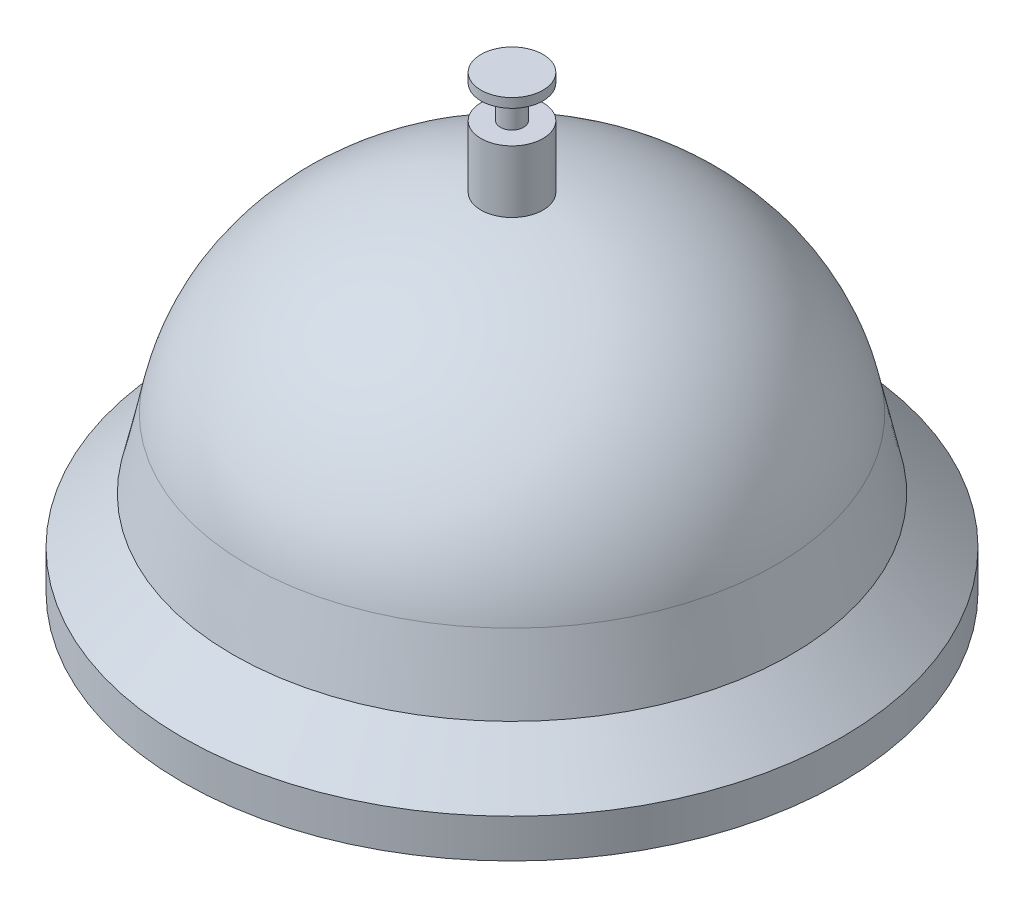
ISO-10303-21;
HEADER;
FILE_DESCRIPTION(('STEP AP214'),'2;1');
FILE_NAME('part.step','',(''),(''),'','','');
FILE_SCHEMA(('AUTOMOTIVE_DESIGN { 1 0 10303 214 1 1 1 1 }'));
ENDSEC;
DATA;
#1=APPLICATION_CONTEXT('core data for automotive mechanical design processes');
#2=APPLICATION_PROTOCOL_DEFINITION('international standard','automotive_design',2000,#1);
#3=PRODUCT_CONTEXT('',#1,'mechanical');
#4=PRODUCT('Part','Part','',(#3));
#5=PRODUCT_RELATED_PRODUCT_CATEGORY('part','',(#4));
#6=PRODUCT_DEFINITION_FORMATION('','',#4);
#7=PRODUCT_DEFINITION_CONTEXT('part definition',#1,'design');
#8=PRODUCT_DEFINITION('design','',#6,#7);
#9=PRODUCT_DEFINITION_SHAPE('','',#8);
#10=(LENGTH_UNIT() NAMED_UNIT(*) SI_UNIT(.MILLI.,.METRE.));
#11=(NAMED_UNIT(*) PLANE_ANGLE_UNIT() SI_UNIT($,.RADIAN.));
#12=(NAMED_UNIT(*) SI_UNIT($,.STERADIAN.) SOLID_ANGLE_UNIT());
#13=UNCERTAINTY_MEASURE_WITH_UNIT(LENGTH_MEASURE(1.E-05),#10,'distance_accuracy_value','');
#14=(GEOMETRIC_REPRESENTATION_CONTEXT(3) GLOBAL_UNCERTAINTY_ASSIGNED_CONTEXT((#13)) GLOBAL_UNIT_ASSIGNED_CONTEXT((#10,
#11,#12)) REPRESENTATION_CONTEXT('',''));
#15=CARTESIAN_POINT('',(0.,0.,0.));
#16=DIRECTION('',(0.,0.,1.));
#17=DIRECTION('',(1.,0.,0.));
#18=AXIS2_PLACEMENT_3D('',#15,#16,#17);
#19=CARTESIAN_POINT('',(0.,20.,-34.));
#20=CARTESIAN_POINT('',(0.,33.2048956625817,-31.3335737867942));
#21=CARTESIAN_POINT('',(0.,44.0758656872333,-19.2643134765452));
#22=CARTESIAN_POINT('',(0.,45.,0.));
#23=B_SPLINE_CURVE_WITH_KNOTS('',3,(#19,#20,#21,#22),.UNSPECIFIED.,.F.,.F.,(4,4),(0.,1.),.UNSPECIFIED.);
#24=CARTESIAN_POINT('',(0.,45.,0.));
#25=DIRECTION('',(0.,1.,0.));
#26=AXIS1_PLACEMENT('',#24,#25);
#27=SURFACE_OF_REVOLUTION('',#23,#26);
#28=CARTESIAN_POINT('',(0.,20.,0.));
#29=DIRECTION('',(0.,1.,0.));
#30=DIRECTION('',(0.,0.,1.));
#31=AXIS2_PLACEMENT_3D('',#28,#29,#30);
#32=CIRCLE('',#31,34.);
#33=CARTESIAN_POINT('',(0.,20.,34.));
#34=VERTEX_POINT('',#33);
#35=EDGE_CURVE('E115',#34,#34,#32,.T.);
#36=ORIENTED_EDGE('',*,*,#35,.T.);
#37=EDGE_LOOP('',(#36));
#38=FACE_BOUND('',#37,.T.);
#39=CARTESIAN_POINT('',(0.,44.6546632895546,0.));
#40=DIRECTION('',(0.,1.,0.));
#41=DIRECTION('',(0.,0.,1.));
#42=AXIS2_PLACEMENT_3D('',#39,#40,#41);
#43=CIRCLE('',#42,4.00000000000004);
#44=CARTESIAN_POINT('',(0.,44.6546632895546,4.00000000000004));
#45=VERTEX_POINT('',#44);
#46=EDGE_CURVE('E44',#45,#45,#43,.T.);
#47=ORIENTED_EDGE('',*,*,#46,.F.);
#48=EDGE_LOOP('',(#47));
#49=FACE_BOUND('',#48,.T.);
#50=ADVANCED_FACE('F40',(#38,#49),#27,.T.);
#51=CARTESIAN_POINT('',(0.,11.,0.));
#52=DIRECTION('',(0.,-1.,0.));
#53=DIRECTION('',(0.,0.,-1.));
#54=AXIS2_PLACEMENT_3D('',#51,#52,#53);
#55=CONICAL_SURFACE('',#54,36.,0.218668945873941);
#56=ORIENTED_EDGE('',*,*,#35,.F.);
#57=EDGE_LOOP('',(#56));
#58=FACE_BOUND('',#57,.T.);
#59=CARTESIAN_POINT('',(0.,11.,0.));
#60=DIRECTION('',(0.,1.,0.));
#61=DIRECTION('',(0.,0.,1.));
#62=AXIS2_PLACEMENT_3D('',#59,#60,#61);
#63=CIRCLE('',#62,36.);
#64=CARTESIAN_POINT('',(0.,11.,36.));
#65=VERTEX_POINT('',#64);
#66=EDGE_CURVE('E112',#65,#65,#63,.T.);
#67=ORIENTED_EDGE('',*,*,#66,.T.);
#68=EDGE_LOOP('',(#67));
#69=FACE_BOUND('',#68,.T.);
#70=ADVANCED_FACE('F124',(#58,#69),#55,.T.);
#71=CARTESIAN_POINT('',(0.,5.,0.));
#72=DIRECTION('',(0.,-1.,0.));
#73=DIRECTION('',(0.,0.,-1.));
#74=AXIS2_PLACEMENT_3D('',#71,#72,#73);
#75=CONICAL_SURFACE('',#74,42.5,0.825376850520739);
#76=ORIENTED_EDGE('',*,*,#66,.F.);
#77=EDGE_LOOP('',(#76));
#78=FACE_BOUND('',#77,.T.);
#79=CARTESIAN_POINT('',(0.,5.,0.));
#80=DIRECTION('',(0.,1.,0.));
#81=DIRECTION('',(0.,0.,1.));
#82=AXIS2_PLACEMENT_3D('',#79,#80,#81);
#83=CIRCLE('',#82,42.5);
#84=CARTESIAN_POINT('',(0.,5.,42.5));
#85=VERTEX_POINT('',#84);
#86=EDGE_CURVE('E108',#85,#85,#83,.T.);
#87=ORIENTED_EDGE('',*,*,#86,.T.);
#88=EDGE_LOOP('',(#87));
#89=FACE_BOUND('',#88,.T.);
#90=ADVANCED_FACE('F128',(#78,#89),#75,.T.);
#91=CARTESIAN_POINT('',(0.,45.,0.));
#92=DIRECTION('',(0.,1.,0.));
#93=DIRECTION('',(0.,0.,1.));
#94=AXIS2_PLACEMENT_3D('',#91,#92,#93);
#95=CYLINDRICAL_SURFACE('',#94,42.5);
#96=ORIENTED_EDGE('',*,*,#86,.F.);
#97=EDGE_LOOP('',(#96));
#98=FACE_BOUND('',#97,.T.);
#99=CARTESIAN_POINT('',(0.,0.,0.));
#100=DIRECTION('',(0.,1.,0.));
#101=DIRECTION('',(0.,0.,1.));
#102=AXIS2_PLACEMENT_3D('',#99,#100,#101);
#103=CIRCLE('',#102,42.5);
#104=CARTESIAN_POINT('',(0.,0.,42.5));
#105=VERTEX_POINT('',#104);
#106=EDGE_CURVE('E63',#105,#105,#103,.T.);
#107=ORIENTED_EDGE('',*,*,#106,.T.);
#108=EDGE_LOOP('',(#107));
#109=FACE_BOUND('',#108,.T.);
#110=ADVANCED_FACE('F133',(#98,#109),#95,.T.);
#111=CARTESIAN_POINT('',(0.,0.,0.));
#112=DIRECTION('',(0.,1.,0.));
#113=DIRECTION('',(0.,0.,1.));
#114=AXIS2_PLACEMENT_3D('',#111,#112,#113);
#115=PLANE('',#114);
#116=CARTESIAN_POINT('',(0.,0.,0.));
#117=DIRECTION('',(0.,1.,0.));
#118=DIRECTION('',(0.,0.,1.));
#119=AXIS2_PLACEMENT_3D('',#116,#117,#118);
#120=CIRCLE('',#119,41.5);
#121=CARTESIAN_POINT('',(0.,0.,41.5));
#122=VERTEX_POINT('',#121);
#123=EDGE_CURVE('E159',#122,#122,#120,.T.);
#124=ORIENTED_EDGE('',*,*,#123,.T.);
#125=EDGE_LOOP('',(#124));
#126=FACE_BOUND('',#125,.T.);
#127=ORIENTED_EDGE('',*,*,#106,.F.);
#128=EDGE_LOOP('',(#127));
#129=FACE_BOUND('',#128,.T.);
#130=ADVANCED_FACE('F55',(#126,#129),#115,.F.);
#131=CARTESIAN_POINT('',(0.,19.6041878504334,-34.0799251972964));
#132=CARTESIAN_POINT('',(0.,19.7361252336222,-34.0532834648643));
#133=CARTESIAN_POINT('',(0.,19.8680626168111,-34.0266417324321));
#134=CARTESIAN_POINT('',(0.,33.1937383188883,-31.3358267567876));
#135=CARTESIAN_POINT('',(0.,44.0574933875595,-19.2847023637044));
#136=CARTESIAN_POINT('',(0.,44.9976361867924,-0.0488161518919489));
#137=B_SPLINE_CURVE_WITH_KNOTS('',3,(#131,#132,#133,#134,#135,#136),.UNSPECIFIED.,.F.,.F.,(4,2,
4),(-0.009991550600642,0.,0.9991550600642),.UNSPECIFIED.);
#138=CARTESIAN_POINT('',(0.,45.,0.));
#139=DIRECTION('',(0.,1.,0.));
#140=AXIS1_PLACEMENT('',#138,#139);
#141=SURFACE_OF_REVOLUTION('',#137,#140);
#142=OFFSET_SURFACE('',#141,-1.,.F.);
#143=CARTESIAN_POINT('',(0.,43.9988284058283,0.));
#144=VERTEX_POINT('',#143);
#145=VERTEX_LOOP('',#144);
#146=FACE_BOUND('',#145,.T.);
#147=CARTESIAN_POINT('',(0.,19.7925491529406,33.021706359646));
#148=CARTESIAN_POINT('',(-0.540316952465533,19.7925491529218,33.0217178211135));
#149=CARTESIAN_POINT('',(-1.08063292967317,19.792549152908,33.0084454078794));
#150=CARTESIAN_POINT('',(-2.15996373717558,19.7925491529003,32.9554151284438));
#151=CARTESIAN_POINT('',(-2.69897856747046,19.7925491529064,32.9156572622443));
#152=CARTESIAN_POINT('',(-3.7744078848469,19.7925491529481,32.8097383733121));
#153=CARTESIAN_POINT('',(-4.31082237192842,19.7925491529837,32.743577350579));
#154=CARTESIAN_POINT('',(-5.37975891094638,19.7925491529877,32.5850151492471));
#155=CARTESIAN_POINT('',(-5.91228096288236,19.7925491529561,32.4926139706453));
#156=CARTESIAN_POINT('',(-6.9721496916611,19.7925491529615,32.2817930920059));
#157=CARTESIAN_POINT('',(-7.49949636850437,19.7925491529985,32.1633733919709));
#158=CARTESIAN_POINT('',(-8.5477439355757,19.792549152993,31.9008010133152));
#159=CARTESIAN_POINT('',(-9.06864482580364,19.7925491529506,31.756648334694));
#160=CARTESIAN_POINT('',(-10.102745920335,19.7925491529353,31.442957205764));
#161=CARTESIAN_POINT('',(-10.6159461246385,19.7925491529624,31.2734187554555));
#162=CARTESIAN_POINT('',(-11.6334095039974,19.792549152966,30.9093645347766));
#163=CARTESIAN_POINT('',(-12.137672679053,19.7925491529425,30.7148487644068));
#164=CARTESIAN_POINT('',(-13.1360471855322,19.7925491529318,30.3013085041184));
#165=CARTESIAN_POINT('',(-13.6301585169557,19.7925491529446,30.0822840141992));
#166=CARTESIAN_POINT('',(-14.6070389787491,19.7925491529517,29.6202539653448));
#167=CARTESIAN_POINT('',(-15.0898081091191,19.7925491529461,29.3772484064096));
#168=CARTESIAN_POINT('',(-16.042841135652,19.7925491529438,28.8678416408431));
#169=CARTESIAN_POINT('',(-16.5131050318153,19.7925491529471,28.6014404342124));
#170=CARTESIAN_POINT('',(-17.4399946830545,19.7925491529444,28.0458841571801));
#171=CARTESIAN_POINT('',(-17.8966204381299,19.7925491529383,27.7567290867778));
#172=CARTESIAN_POINT('',(-18.7951337557283,19.7925491529343,27.1563616820768));
#173=CARTESIAN_POINT('',(-19.2370213182513,19.7925491529364,26.8451493477786));
#174=CARTESIAN_POINT('',(-20.1049937049084,19.7925491529319,26.2014171530663));
#175=CARTESIAN_POINT('',(-20.5310785290424,19.7925491529251,25.8688972926525));
#176=CARTESIAN_POINT('',(-21.3664189632672,19.7925491529352,25.1833511151621));
#177=CARTESIAN_POINT('',(-21.7756745733575,19.7925491529519,24.8303247980852));
#178=CARTESIAN_POINT('',(-22.5763706468891,19.7925491529543,24.104616178596));
#179=CARTESIAN_POINT('',(-22.96781111033,19.79254915294,23.7319338761835));
#180=CARTESIAN_POINT('',(-23.7319338761835,19.7925491529401,22.96781111033));
#181=CARTESIAN_POINT('',(-24.1046161785961,19.7925491529544,22.5763706468891));
#182=CARTESIAN_POINT('',(-24.8303247980781,19.7925491529519,21.7756745733653));
#183=CARTESIAN_POINT('',(-25.1833511151482,19.7925491529351,21.3664189632832));
#184=CARTESIAN_POINT('',(-25.8688972926226,19.7925491529252,20.5310785290798));
#185=CARTESIAN_POINT('',(-26.2014171530274,19.7925491529322,20.1049937049591));
#186=CARTESIAN_POINT('',(-26.8451493477474,19.7925491529361,19.2370213182952));
#187=CARTESIAN_POINT('',(-27.1563616820606,19.792549152933,18.7951337557506));
#188=CARTESIAN_POINT('',(-27.7567290867823,19.7925491529396,17.8966204381251));
#189=CARTESIAN_POINT('',(-28.0458841571913,19.7925491529491,17.4399946830446));
#190=CARTESIAN_POINT('',(-28.6014404342166,19.7925491529424,16.5131050317996));
#191=CARTESIAN_POINT('',(-28.8678416408338,19.792549152926,16.0428411356356));
#192=CARTESIAN_POINT('',(-29.3772484064468,19.792549152925,15.0898081090997));
#193=CARTESIAN_POINT('',(-29.6202539654418,19.7925491529403,14.6070389787274));
#194=CARTESIAN_POINT('',(-30.0822840141377,19.7925491529384,13.6301585169109));
#195=CARTESIAN_POINT('',(-30.3013085038384,19.7925491529211,13.1360471854666));
#196=CARTESIAN_POINT('',(-30.714848764726,19.7925491529375,12.1376726790323));
#197=CARTESIAN_POINT('',(-30.9093645359154,19.7925491529711,11.6334095040433));
#198=CARTESIAN_POINT('',(-31.2734187543191,19.7925491529712,10.6159461245777));
#199=CARTESIAN_POINT('',(-31.4429572015306,19.7925491529377,10.1027459201001));
#200=CARTESIAN_POINT('',(-31.7566483389501,19.7925491529482,9.06864482596402));
#201=CARTESIAN_POINT('',(-31.9008010291589,19.7925491529923,8.54774393630578));
#202=CARTESIAN_POINT('',(-32.1633733761504,19.7925491529991,7.49949636768157));
#203=CARTESIAN_POINT('',(-32.2817930329338,19.7925491529618,6.97214968871573));
#204=CARTESIAN_POINT('',(-32.4926140297268,19.7925491529559,5.91228096578034));
#205=CARTESIAN_POINT('',(-32.5850153697357,19.7925491529873,5.37975892181062));
#206=CARTESIAN_POINT('',(-32.7435771300798,19.7925491529841,4.31082236113562));
#207=CARTESIAN_POINT('',(-32.8097375504151,19.7925491529496,3.77440784443032));
#208=CARTESIAN_POINT('',(-32.915658085142,19.7925491529049,2.69897860787977));
#209=CARTESIAN_POINT('',(-32.9554181995357,19.7925491528948,2.15996388803471));
#210=CARTESIAN_POINT('',(-33.0084423367886,19.7925491529135,1.0806327787932));
#211=CARTESIAN_POINT('',(-33.0217063596457,19.7925491529423,0.540316389396641));
#212=CARTESIAN_POINT('',(-33.0217063596463,19.792549152939,-0.540316389396594));
#213=CARTESIAN_POINT('',(-33.0084423367899,19.7925491529068,-1.08063277879327));
#214=CARTESIAN_POINT('',(-32.9554181995343,19.7925491529015,-2.15996388803445));
#215=CARTESIAN_POINT('',(-32.9156580851373,19.7925491529284,-2.69897860787907));
#216=CARTESIAN_POINT('',(-32.8097375504198,19.7925491529261,-3.77440784443112));
#217=CARTESIAN_POINT('',(-32.7435771300973,19.7925491528968,-4.31082236113834));
#218=CARTESIAN_POINT('',(-32.5850153697507,19.7925491529114,-5.37975892181356));
#219=CARTESIAN_POINT('',(-32.4926140297268,19.7925491529552,-5.91228096578156));
#220=CARTESIAN_POINT('',(-32.2817930329332,19.7925491529624,-6.97214968871773));
#221=CARTESIAN_POINT('',(-32.1633733761646,19.7925491529259,-7.4994963676861));
#222=CARTESIAN_POINT('',(-31.9008010291681,19.7925491529055,-8.54774393634087));
#223=CARTESIAN_POINT('',(-31.7566483389382,19.7925491529217,-9.06864482602676));
#224=CARTESIAN_POINT('',(-31.4429572015168,19.7925491529521,-10.10274592013));
#225=CARTESIAN_POINT('',(-31.2734187543289,19.7925491529664,-10.6159461245486));
#226=CARTESIAN_POINT('',(-30.9093645359408,19.7925491529621,-11.6334095039822));
#227=CARTESIAN_POINT('',(-30.7148487647392,19.7925491529437,-12.1376726789968));
#228=CARTESIAN_POINT('',(-30.3013085038399,19.7925491529307,-13.1360471854584));
#229=CARTESIAN_POINT('',(-30.082284014141,19.7925491529361,-13.6301585169048));
#230=CARTESIAN_POINT('',(-29.620253965444,19.7925491529426,-14.6070389787218));
#231=CARTESIAN_POINT('',(-29.3772484064462,19.7925491529436,-15.0898081090926));
#232=CARTESIAN_POINT('',(-28.8678416408322,19.7925491529462,-16.0428411356302));
#233=CARTESIAN_POINT('',(-28.6014404342166,19.7925491529478,-16.5131050317974));
#234=CARTESIAN_POINT('',(-28.0458841571946,19.7925491529437,-17.4399946830412));
#235=CARTESIAN_POINT('',(-27.7567290867875,19.7925491529381,-17.8966204381174));
#236=CARTESIAN_POINT('',(-27.1563616820897,19.7925491529345,-18.7951337557069));
#237=CARTESIAN_POINT('',(-26.8451493477998,19.7925491529365,-19.2370213182207));
#238=CARTESIAN_POINT('',(-26.2014171530842,19.7925491529318,-20.1049937048862));
#239=CARTESIAN_POINT('',(-25.8688972926573,19.7925491529252,-20.531078529037));
#240=CARTESIAN_POINT('',(-25.1833511151552,19.7925491529351,-21.3664189632751));
#241=CARTESIAN_POINT('',(-24.8303247980806,19.7925491529518,-21.7756745733627));
#242=CARTESIAN_POINT('',(-24.1046161786024,19.7925491529545,-22.576370646882));
#243=CARTESIAN_POINT('',(-23.7319338761988,19.7925491529405,-22.9678111103136));
#244=CARTESIAN_POINT('',(-22.96781111034,19.7925491529396,-23.7319338761744));
#245=CARTESIAN_POINT('',(-22.5763706468835,19.7925491529526,-24.1046161786023));
#246=CARTESIAN_POINT('',(-21.7756745733455,19.7925491529537,-24.8303247980949));
#247=CARTESIAN_POINT('',(-21.3664189632656,19.7925491529418,-25.1833511151613));
#248=CARTESIAN_POINT('',(-20.5310785290482,19.7925491529185,-25.8688972926499));
#249=CARTESIAN_POINT('',(-20.1049937049103,19.7925491529072,-26.2014171530717));
#250=CARTESIAN_POINT('',(-19.2370213182456,19.7925491529119,-26.8451493477884));
#251=CARTESIAN_POINT('',(-18.7951337557188,19.7925491529279,-27.1563616820833));
#252=CARTESIAN_POINT('',(-17.8966204381142,19.7925491529447,-27.756729086788));
#253=CARTESIAN_POINT('',(-17.4399946830361,19.7925491529455,-28.0458841571974));
#254=CARTESIAN_POINT('',(-16.5131050317993,19.792549152946,-28.6014404342157));
#255=CARTESIAN_POINT('',(-16.0428411356414,19.7925491529457,-28.8678416408259));
#256=CARTESIAN_POINT('',(-15.0898081091059,19.7925491529442,-29.3772484064395));
#257=CARTESIAN_POINT('',(-14.6070389787275,19.792549152943,-29.6202539654413));
#258=CARTESIAN_POINT('',(-13.6301585169091,19.7925491529357,-30.082284014139));
#259=CARTESIAN_POINT('',(-13.1360471854693,19.7925491529295,-30.3013085038352));
#260=CARTESIAN_POINT('',(-12.1376726790138,19.7925491529448,-30.7148487647322));
#261=CARTESIAN_POINT('',(-11.6334095039985,19.7925491529663,-30.9093645359338));
#262=CARTESIAN_POINT('',(-10.6159461245317,19.7925491529622,-31.2734187543362));
#263=CARTESIAN_POINT('',(-10.1027459200802,19.7925491529367,-31.4429572015367));
#264=CARTESIAN_POINT('',(-9.06864482597438,19.7925491529492,-31.7566483389468));
#265=CARTESIAN_POINT('',(-8.54774393631999,19.7925491529872,-31.9008010291561));
#266=CARTESIAN_POINT('',(-7.49949636769881,19.7925491530043,-32.1633733761454));
#267=CARTESIAN_POINT('',(-6.97214968873211,19.7925491529835,-32.2817930329258));
#268=CARTESIAN_POINT('',(-5.91228096579634,19.7925491529342,-32.4926140297284));
#269=CARTESIAN_POINT('',(-5.37975892182708,19.7925491529058,-32.5850153697496));
#270=CARTESIAN_POINT('',(-4.31082236114881,19.7925491529025,-32.7435771300948));
#271=CARTESIAN_POINT('',(-3.77440784443978,19.7925491529277,-32.8097375504185));
#272=CARTESIAN_POINT('',(-2.69897860788494,19.7925491529268,-32.9156580851371));
#273=CARTESIAN_POINT('',(-2.15996388803935,19.7925491529007,-32.9554181995342));
#274=CARTESIAN_POINT('',(-1.08063277879591,19.7925491529076,-33.0084423367897));
#275=CARTESIAN_POINT('',(-0.540316389397953,19.7925491529406,-33.021706359646));
#276=CARTESIAN_POINT('',(0.540316389397953,19.7925491529406,-33.021706359646));
#277=CARTESIAN_POINT('',(1.08063277879591,19.7925491529076,-33.0084423367897));
#278=CARTESIAN_POINT('',(2.15996388803935,19.7925491529007,-32.9554181995342));
#279=CARTESIAN_POINT('',(2.69897860788494,19.7925491529268,-32.9156580851371));
#280=CARTESIAN_POINT('',(3.77440784443978,19.7925491529277,-32.8097375504185));
#281=CARTESIAN_POINT('',(4.31082236114881,19.7925491529025,-32.7435771300948));
#282=CARTESIAN_POINT('',(5.37975892182708,19.7925491529058,-32.5850153697496));
#283=CARTESIAN_POINT('',(5.91228096579634,19.7925491529342,-32.4926140297284));
#284=CARTESIAN_POINT('',(6.97214968873211,19.7925491529835,-32.2817930329258));
#285=CARTESIAN_POINT('',(7.49949636769881,19.7925491530043,-32.1633733761454));
#286=CARTESIAN_POINT('',(8.54774393631999,19.7925491529872,-31.9008010291561));
#287=CARTESIAN_POINT('',(9.06864482597438,19.7925491529492,-31.7566483389468));
#288=CARTESIAN_POINT('',(10.1027459200802,19.7925491529367,-31.4429572015367));
#289=CARTESIAN_POINT('',(10.6159461245317,19.7925491529622,-31.2734187543362));
#290=CARTESIAN_POINT('',(11.6334095039985,19.7925491529663,-30.9093645359338));
#291=CARTESIAN_POINT('',(12.1376726790138,19.7925491529448,-30.7148487647322));
#292=CARTESIAN_POINT('',(13.1360471854693,19.7925491529296,-30.3013085038352));
#293=CARTESIAN_POINT('',(13.6301585169091,19.7925491529358,-30.082284014139));
#294=CARTESIAN_POINT('',(14.6070389787275,19.7925491529429,-29.6202539654413));
#295=CARTESIAN_POINT('',(15.0898081091059,19.7925491529437,-29.3772484064395));
#296=CARTESIAN_POINT('',(16.0428411356413,19.7925491529462,-28.8678416408258));
#297=CARTESIAN_POINT('',(16.5131050317991,19.7925491529478,-28.6014404342154));
#298=CARTESIAN_POINT('',(17.4399946830443,19.7925491529437,-28.0458841571929));
#299=CARTESIAN_POINT('',(17.8966204381307,19.7925491529381,-27.7567290867792));
#300=CARTESIAN_POINT('',(18.7951337557608,19.7925491529345,-27.1563616820531));
#301=CARTESIAN_POINT('',(19.2370213183045,19.7925491529365,-26.8451493477406));
#302=CARTESIAN_POINT('',(20.1049937049598,19.7925491529318,-26.2014171530268));
#303=CARTESIAN_POINT('',(20.5310785290731,19.7925491529251,-25.8688972926277));
#304=CARTESIAN_POINT('',(21.3664189632664,19.7925491529352,-25.1833511151623));
#305=CARTESIAN_POINT('',(21.7756745733457,19.7925491529519,-24.8303247980952));
#306=CARTESIAN_POINT('',(22.5763706468745,19.7925491529543,-24.1046161786099));
#307=CARTESIAN_POINT('',(22.9678111103229,19.79254915294,-23.7319338761906));
#308=CARTESIAN_POINT('',(23.7319338761826,19.79254915294,-22.9678111103308));
#309=CARTESIAN_POINT('',(24.1046161785945,19.7925491529543,-22.5763706468908));
#310=CARTESIAN_POINT('',(24.8303247980806,19.7925491529519,-21.7756745733627));
#311=CARTESIAN_POINT('',(25.1833511151552,19.7925491529352,-21.3664189632751));
#312=CARTESIAN_POINT('',(25.868897292634,19.7925491529251,-20.5310785290654));
#313=CARTESIAN_POINT('',(26.201417153039,19.7925491529318,-20.1049937049441));
#314=CARTESIAN_POINT('',(26.845149347752,19.7925491529365,-19.2370213182882));
#315=CARTESIAN_POINT('',(27.1563616820587,19.7925491529345,-18.7951337557526));
#316=CARTESIAN_POINT('',(27.7567290867776,19.7925491529381,-17.8966204381331));
#317=CARTESIAN_POINT('',(28.0458841571898,19.7925491529437,-17.4399946830491));
#318=CARTESIAN_POINT('',(28.6014404342166,19.7925491529478,-16.5131050317974));
#319=CARTESIAN_POINT('',(28.8678416408322,19.7925491529462,-16.0428411356302));
#320=CARTESIAN_POINT('',(29.3772484064429,19.7925491529437,-15.0898081090989));
#321=CARTESIAN_POINT('',(29.6202539654375,19.7925491529429,-14.6070389787346));
#322=CARTESIAN_POINT('',(30.0822840141353,19.7925491529358,-13.6301585169179));
#323=CARTESIAN_POINT('',(30.3013085038374,19.7925491529296,-13.136047185465));
#324=CARTESIAN_POINT('',(30.714848764739,19.7925491529448,-12.1376726789967));
#325=CARTESIAN_POINT('',(30.90936453594,19.7925491529663,-11.633409503982));
#326=CARTESIAN_POINT('',(31.2734187543413,19.7925491529622,-10.6159461245165));
#327=CARTESIAN_POINT('',(31.4429572015413,19.7925491529367,-10.1027459200656));
#328=CARTESIAN_POINT('',(31.7566483389512,19.7925491529492,-9.06864482595924));
#329=CARTESIAN_POINT('',(31.9008010291605,19.7925491529871,-8.54774393630358));
#330=CARTESIAN_POINT('',(32.1633733761492,19.7925491530043,-7.49949636768222));
#331=CARTESIAN_POINT('',(32.2817930329291,19.7925491529835,-6.97214968871663));
#332=CARTESIAN_POINT('',(32.4926140297309,19.7925491529341,-5.91228096578253));
#333=CARTESIAN_POINT('',(32.5850153697519,19.7925491529056,-5.37975892181382));
#334=CARTESIAN_POINT('',(32.7435771300913,19.7925491529026,-4.31082236117071));
#335=CARTESIAN_POINT('',(32.8097375504113,19.7925491529282,-3.77440784449653));
#336=CARTESIAN_POINT('',(32.9156580851326,19.7925491529273,-2.69897860794498));
#337=CARTESIAN_POINT('',(32.9554181995328,19.7925491529008,-2.15996388806749));
#338=CARTESIAN_POINT('',(33.0084423367898,19.7925491529075,-1.08063277879335));
#339=CARTESIAN_POINT('',(33.021706359646,19.7925491529406,-0.540316389396676));
#340=CARTESIAN_POINT('',(33.021706359646,19.7925491529407,0.540316389396621));
#341=CARTESIAN_POINT('',(33.0084423367897,19.7925491529078,1.08063277879324));
#342=CARTESIAN_POINT('',(32.9554181995345,19.7925491529005,2.15996388803446));
#343=CARTESIAN_POINT('',(32.9156580851377,19.7925491529262,2.69897860787915));
#344=CARTESIAN_POINT('',(32.8097375504193,19.7925491529282,3.77440784443165));
#345=CARTESIAN_POINT('',(32.7435771300956,19.7925491529046,4.31082236113924));
#346=CARTESIAN_POINT('',(32.5850153697515,19.7925491529067,5.3797589218142));
#347=CARTESIAN_POINT('',(32.4926140297314,19.7925491529326,5.91228096578159));
#348=CARTESIAN_POINT('',(32.2817930329299,19.792549152981,6.97214968871513));
#349=CARTESIAN_POINT('',(32.1633733761495,19.7925491530037,7.49949636768145));
#350=CARTESIAN_POINT('',(31.9008010291604,19.7925491529878,8.54774393630356));
#351=CARTESIAN_POINT('',(31.7566483389512,19.7925491529492,9.06864482595924));
#352=CARTESIAN_POINT('',(31.4429572015414,19.7925491529366,10.1027459200656));
#353=CARTESIAN_POINT('',(31.2734187543412,19.7925491529625,10.6159461245164));
#354=CARTESIAN_POINT('',(30.9093645359297,19.7925491529659,11.633409504011));
#355=CARTESIAN_POINT('',(30.714848764717,19.7925491529434,12.1376726790544));
#356=CARTESIAN_POINT('',(30.3013085038084,19.7925491529309,13.1360471855303));
#357=CARTESIAN_POINT('',(30.0822840141132,19.792549152941,13.6301585169633));
#358=CARTESIAN_POINT('',(29.6202539654287,19.7925491529377,14.6070389787546));
#359=CARTESIAN_POINT('',(29.3772484064398,19.7925491529243,15.0898081091131));
#360=CARTESIAN_POINT('',(28.8678416408337,19.7925491529267,16.0428411356355));
#361=CARTESIAN_POINT('',(28.6014404342165,19.7925491529424,16.5131050317996));
#362=CARTESIAN_POINT('',(28.0458841571913,19.7925491529491,17.4399946830446));
#363=CARTESIAN_POINT('',(27.7567290867822,19.79254915294,17.8966204381251));
#364=CARTESIAN_POINT('',(27.1563616820607,19.7925491529326,18.7951337557506));
#365=CARTESIAN_POINT('',(26.8451493477476,19.7925491529344,19.2370213182954));
#366=CARTESIAN_POINT('',(26.2014171530195,19.7925491529339,20.1049937049692));
#367=CARTESIAN_POINT('',(25.8688972926058,19.7925491529315,20.5310785290993));
#368=CARTESIAN_POINT('',(25.1833511151306,19.7925491529402,21.3664189633021));
#369=CARTESIAN_POINT('',(24.8303247980695,19.7925491529513,21.775674573375));
#370=CARTESIAN_POINT('',(24.1046161785881,19.792549152955,22.5763706468977));
#371=CARTESIAN_POINT('',(23.7319338761662,19.7925491529477,22.9678111103459));
#372=CARTESIAN_POINT('',(22.9678111103305,19.7925491529324,23.7319338761843));
#373=CARTESIAN_POINT('',(22.5763706469185,19.7925491529245,24.104616178576));
#374=CARTESIAN_POINT('',(21.7756745733984,19.7925491529263,24.8303247980567));
#375=CARTESIAN_POINT('',(21.3664189632889,19.792549152936,25.1833511151439));
#376=CARTESIAN_POINT('',(20.5310785290564,19.7925491529244,25.8688972926414));
#377=CARTESIAN_POINT('',(20.1049937049347,19.7925491529031,26.2014171530532));
#378=CARTESIAN_POINT('',(19.2370213182684,19.7925491529161,26.8451493477719));
#379=CARTESIAN_POINT('',(18.7951337557225,19.7925491529503,27.1563616820773));
#380=CARTESIAN_POINT('',(17.8966204381109,19.7925491529681,27.7567290867827));
#381=CARTESIAN_POINT('',(17.4399946830457,19.7925491529518,28.0458841571836));
#382=CARTESIAN_POINT('',(16.5131050318102,19.7925491529397,28.6014404342171));
#383=CARTESIAN_POINT('',(16.0428411356401,19.792549152944,28.8678416408498));
#384=CARTESIAN_POINT('',(15.0898081090966,19.7925491529459,29.3772484064213));
#385=CARTESIAN_POINT('',(14.607038978723,19.7925491529435,29.6202539653596));
#386=CARTESIAN_POINT('',(13.6301585169355,19.7925491529352,30.0822840142103));
#387=CARTESIAN_POINT('',(13.1360471855219,19.7925491529294,30.3013085041232));
#388=CARTESIAN_POINT('',(12.1376726790211,19.7925491529449,30.7148487644194));
#389=CARTESIAN_POINT('',(11.6334095039335,19.7925491529663,30.9093645348012));
#390=CARTESIAN_POINT('',(10.6159461245736,19.7925491529622,31.273418755477));
#391=CARTESIAN_POINT('',(10.1027459203022,19.7925491529367,31.4429572057736));
#392=CARTESIAN_POINT('',(9.06864482580368,19.7925491529492,31.7566483346943));
#393=CARTESIAN_POINT('',(8.54774393557589,19.7925491529872,31.9008010133163));
#394=CARTESIAN_POINT('',(7.49949636847169,19.7925491530042,32.1633733919779));
#395=CARTESIAN_POINT('',(6.97214969159499,19.7925491529832,32.2817930920162));
#396=CARTESIAN_POINT('',(5.91228096285044,19.7925491529344,32.4926139706544));
#397=CARTESIAN_POINT('',(5.37975891098305,19.7925491529066,32.5850151492566));
#398=CARTESIAN_POINT('',(4.31082237199881,19.7925491529017,32.743577350587));
#399=CARTESIAN_POINT('',(3.7744078848817,19.7925491529246,32.8097383733134));
#400=CARTESIAN_POINT('',(2.69897856746988,19.7925491529298,32.9156572622396));
#401=CARTESIAN_POINT('',(2.15996373717537,19.792549152912,32.9554151284414));
#402=CARTESIAN_POINT('',(1.0806329296736,19.7925491528963,33.0084454078818));
#403=CARTESIAN_POINT('',(0.540316952466223,19.7925491528983,33.0217178211181));
#404=CARTESIAN_POINT('',(0.,19.7925491529406,33.021706359646));
#405=B_SPLINE_CURVE_WITH_KNOTS('',3,(#147,#148,#149,#150,#151,#152,#153,#154,#155,#156,#157,
#158,#159,#160,#161,#162,#163,#164,#165,#166,#167,#168,#169,#170,#171,#172,#173,#174,#175,#176,
#177,#178,#179,#180,#181,#182,#183,#184,#185,#186,#187,#188,#189,#190,#191,#192,#193,#194,#195,
#196,#197,#198,#199,#200,#201,#202,#203,#204,#205,#206,#207,#208,#209,#210,#211,#212,#213,#214,
#215,#216,#217,#218,#219,#220,#221,#222,#223,#224,#225,#226,#227,#228,#229,#230,#231,#232,#233,
#234,#235,#236,#237,#238,#239,#240,#241,#242,#243,#244,#245,#246,#247,#248,#249,#250,#251,#252,
#253,#254,#255,#256,#257,#258,#259,#260,#261,#262,#263,#264,#265,#266,#267,#268,#269,#270,#271,
#272,#273,#274,#275,#276,#277,#278,#279,#280,#281,#282,#283,#284,#285,#286,#287,#288,#289,#290,
#291,#292,#293,#294,#295,#296,#297,#298,#299,#300,#301,#302,#303,#304,#305,#306,#307,#308,#309,
#310,#311,#312,#313,#314,#315,#316,#317,#318,#319,#320,#321,#322,#323,#324,#325,#326,#327,#328,
#329,#330,#331,#332,#333,#334,#335,#336,#337,#338,#339,#340,#341,#342,#343,#344,#345,#346,#347,
#348,#349,#350,#351,#352,#353,#354,#355,#356,#357,#358,#359,#360,#361,#362,#363,#364,#365,#366,
#367,#368,#369,#370,#371,#372,#373,#374,#375,#376,#377,#378,#379,#380,#381,#382,#383,#384,#385,
#386,#387,#388,#389,#390,#391,#392,#393,#394,#395,#396,#397,#398,#399,#400,#401,#402,#403,#404),
.UNSPECIFIED.,.F.,.F.,(4,2,2,2,2,2,2,2,2,2,2,2,2,2,2,2,2,2,2,2,2,2,2,2,2,2,2,2,2,2,2,2,2,2,2,2,
2,2,2,2,2,2,2,2,2,2,2,2,2,2,2,2,2,2,2,2,2,2,2,2,2,2,2,2,2,2,2,2,2,2,2,2,2,2,2,2,2,2,2,2,2,2,2,2,
2,2,2,2,2,2,2,2,2,2,2,2,2,2,2,2,2,2,2,2,2,2,2,2,2,2,2,2,2,2,2,2,2,2,2,2,2,2,2,2,2,2,2,2,4),(0.,
1.62078648403252,3.24157296793376,4.86235945186116,6.48314593598312,8.10393241994571,
9.72471890393707,11.3455053879056,12.9662918718422,14.587078355824,16.2078648398038,
17.8286513237374,19.449437807723,21.0702242916848,22.691010775635,24.3117972596189,
25.9325837436335,27.5533702276482,29.1741567116004,30.794943195502,32.415729679544,
34.0365161635468,35.657302647484,37.2780891314779,38.8988756154921,40.5196620993434,
42.1404485833811,43.7612350673703,45.3820215513257,47.0028080353366,48.6235945193538,
50.2443810032454,51.8651674872674,53.4859539712892,55.1067404551809,56.7275269391985,
58.3483134232123,59.9690999071657,61.5898863912509,63.2106728750989,64.8314593590348,
66.4522458430527,68.0730323270463,69.6938188109895,71.3146052949782,72.9353917789047,
74.556178262918,76.1769647468915,77.7977512308673,79.4185377149474,81.0393241988873,
82.6601106828606,84.2808971668274,85.9016836508247,87.5224701347357,89.1432566187553,
90.7640431027517,92.3848295866898,94.005616070643,95.6264025546212,97.2471890385778,
98.8679755225933,100.488762006617,102.109548490512,103.730334974537,105.351121458563,
106.971907942458,108.592694426481,110.213480910497,111.834267394453,113.455053878432,
115.075840362385,116.696626846323,118.317413330319,119.938199814339,121.55898629825,
123.179772782275,124.800559266314,126.421345750187,128.042132234127,129.662918718172,
131.283705202183,132.904491686156,134.52527817006,136.146064654068,137.766851138085,
139.387637622028,141.008424106,142.62921059004,144.249997073975,145.870783557926,
147.491570041908,149.112356525861,150.733143009875,152.353929493794,153.974715977784,
155.595502461806,157.216288945828,158.83707542972,160.457861913739,162.078648397749,
163.699434881704,165.320221365686,166.941007849637,168.561794333665,170.182580817642,
171.80336730159,173.424153785527,175.04494026953,176.665726753572,178.286513237513,
179.907299721426,181.528086205476,183.148872689385,184.769659173433,186.39044565735,
188.011232141379,189.632018625337,191.252805109291,192.873591593285,194.494378077232,
196.115164561272,197.735951045138,199.356737529129,200.977524013192,202.598310497111,
204.219096981142,205.839883465043,207.460669949075),.UNSPECIFIED.);
#406=CARTESIAN_POINT('',(0.,19.7925491529406,33.021706359646));
#407=VERTEX_POINT('',#406);
#408=EDGE_CURVE('E59',#407,#407,#405,.F.);
#409=ORIENTED_EDGE('',*,*,#408,.F.);
#410=EDGE_LOOP('',(#409));
#411=FACE_BOUND('',#410,.T.);
#412=ADVANCED_FACE('F51',(#146,#411),#142,.F.);
#413=CARTESIAN_POINT('',(0.,10.7830695421813,0.));
#414=DIRECTION('',(0.,-1.,0.));
#415=DIRECTION('',(0.,0.,-1.));
#416=AXIS2_PLACEMENT_3D('',#413,#414,#415);
#417=CONICAL_SURFACE('',#416,35.023812939816,0.218668945873941);
#418=ORIENTED_EDGE('',*,*,#408,.T.);
#419=EDGE_LOOP('',(#418));
#420=FACE_BOUND('',#419,.T.);
#421=CARTESIAN_POINT('',(0.,10.4775083803325,0.));
#422=DIRECTION('',(0.,1.,0.));
#423=DIRECTION('',(0.,0.,1.));
#424=AXIS2_PLACEMENT_3D('',#421,#422,#423);
#425=CIRCLE('',#424,35.0917154202269);
#426=CARTESIAN_POINT('',(0.,10.4775083803325,35.0917154202269));
#427=VERTEX_POINT('',#426);
#428=EDGE_CURVE('E64',#427,#427,#425,.T.);
#429=ORIENTED_EDGE('',*,*,#428,.F.);
#430=EDGE_LOOP('',(#429));
#431=FACE_BOUND('',#430,.T.);
#432=ADVANCED_FACE('F54',(#420,#431),#417,.F.);
#433=CARTESIAN_POINT('',(0.,4.26519655537251,0.));
#434=DIRECTION('',(0.,-1.,0.));
#435=DIRECTION('',(0.,0.,-1.));
#436=AXIS2_PLACEMENT_3D('',#433,#434,#435);
#437=CONICAL_SURFACE('',#436,41.8217198972669,0.825376850520739);
#438=ORIENTED_EDGE('',*,*,#428,.T.);
#439=EDGE_LOOP('',(#438));
#440=FACE_BOUND('',#439,.T.);
#441=CARTESIAN_POINT('',(0.,4.56216876823429,0.));
#442=DIRECTION('',(0.,-1.,0.));
#443=DIRECTION('',(0.,0.,-1.));
#444=AXIS2_PLACEMENT_3D('',#441,#442,#443);
#445=CIRCLE('',#444,41.5);
#446=CARTESIAN_POINT('',(0.,4.56216876823429,-41.5));
#447=VERTEX_POINT('',#446);
#448=EDGE_CURVE('E156',#447,#447,#445,.F.);
#449=ORIENTED_EDGE('',*,*,#448,.F.);
#450=EDGE_LOOP('',(#449));
#451=FACE_BOUND('',#450,.T.);
#452=ADVANCED_FACE('F89',(#440,#451),#437,.F.);
#453=CARTESIAN_POINT('',(0.,45.,0.));
#454=DIRECTION('',(0.,1.,0.));
#455=DIRECTION('',(0.,0.,1.));
#456=AXIS2_PLACEMENT_3D('',#453,#454,#455);
#457=CYLINDRICAL_SURFACE('',#456,41.5);
#458=ORIENTED_EDGE('',*,*,#448,.T.);
#459=EDGE_LOOP('',(#458));
#460=FACE_BOUND('',#459,.T.);
#461=ORIENTED_EDGE('',*,*,#123,.F.);
#462=EDGE_LOOP('',(#461));
#463=FACE_BOUND('',#462,.T.);
#464=ADVANCED_FACE('F143',(#460,#463),#457,.F.);
#465=CARTESIAN_POINT('',(0.,52.6546632895546,0.));
#466=DIRECTION('',(0.,-1.,0.));
#467=DIRECTION('',(0.,0.,-1.));
#468=AXIS2_PLACEMENT_3D('',#465,#466,#467);
#469=CYLINDRICAL_SURFACE('',#468,3.99999999999994);
#470=CARTESIAN_POINT('',(0.,52.6546632895546,0.));
#471=DIRECTION('',(0.,1.,0.));
#472=DIRECTION('',(0.,0.,1.));
#473=AXIS2_PLACEMENT_3D('',#470,#471,#472);
#474=CIRCLE('',#473,3.99999999999994);
#475=CARTESIAN_POINT('',(0.,52.6546632895546,3.99999999999994));
#476=VERTEX_POINT('',#475);
#477=EDGE_CURVE('E161',#476,#476,#474,.T.);
#478=ORIENTED_EDGE('',*,*,#477,.F.);
#479=EDGE_LOOP('',(#478));
#480=FACE_BOUND('',#479,.T.);
#481=ORIENTED_EDGE('',*,*,#46,.T.);
#482=EDGE_LOOP('',(#481));
#483=FACE_BOUND('',#482,.T.);
#484=ADVANCED_FACE('F82',(#480,#483),#469,.T.);
#485=CARTESIAN_POINT('',(0.,52.6546632895546,0.));
#486=DIRECTION('',(0.,1.,0.));
#487=DIRECTION('',(0.,0.,1.));
#488=AXIS2_PLACEMENT_3D('',#485,#486,#487);
#489=PLANE('',#488);
#490=CARTESIAN_POINT('',(0.,52.6546632895546,0.));
#491=DIRECTION('',(0.,1.,0.));
#492=DIRECTION('',(0.,0.,1.));
#493=AXIS2_PLACEMENT_3D('',#490,#491,#492);
#494=CIRCLE('',#493,1.5);
#495=CARTESIAN_POINT('',(0.,52.6546632895546,1.50000000000006));
#496=VERTEX_POINT('',#495);
#497=EDGE_CURVE('E11',#496,#496,#494,.T.);
#498=ORIENTED_EDGE('',*,*,#497,.F.);
#499=EDGE_LOOP('',(#498));
#500=FACE_BOUND('',#499,.T.);
#501=ORIENTED_EDGE('',*,*,#477,.T.);
#502=EDGE_LOOP('',(#501));
#503=FACE_BOUND('',#502,.T.);
#504=ADVANCED_FACE('F150',(#500,#503),#489,.T.);
#505=CARTESIAN_POINT('',(0.,56.8546632895546,0.));
#506=DIRECTION('',(0.,-1.,0.));
#507=DIRECTION('',(0.,0.,-1.));
#508=AXIS2_PLACEMENT_3D('',#505,#506,#507);
#509=CYLINDRICAL_SURFACE('',#508,1.5);
#510=CARTESIAN_POINT('',(0.,56.8546632895546,0.));
#511=DIRECTION('',(0.,1.,0.));
#512=DIRECTION('',(0.,0.,1.));
#513=AXIS2_PLACEMENT_3D('',#510,#511,#512);
#514=CIRCLE('',#513,1.5);
#515=CARTESIAN_POINT('',(0.,56.8546632895546,1.50000000000006));
#516=VERTEX_POINT('',#515);
#517=EDGE_CURVE('E165',#516,#516,#514,.T.);
#518=ORIENTED_EDGE('',*,*,#517,.F.);
#519=EDGE_LOOP('',(#518));
#520=FACE_BOUND('',#519,.T.);
#521=ORIENTED_EDGE('',*,*,#497,.T.);
#522=EDGE_LOOP('',(#521));
#523=FACE_BOUND('',#522,.T.);
#524=ADVANCED_FACE('F185',(#520,#523),#509,.T.);
#525=CARTESIAN_POINT('',(0.,58.0546632895546,0.));
#526=DIRECTION('',(0.,-1.,0.));
#527=DIRECTION('',(0.,0.,-1.));
#528=AXIS2_PLACEMENT_3D('',#525,#526,#527);
#529=CYLINDRICAL_SURFACE('',#528,4.);
#530=CARTESIAN_POINT('',(0.,58.0546632895546,0.));
#531=DIRECTION('',(0.,1.,0.));
#532=DIRECTION('',(0.,0.,1.));
#533=AXIS2_PLACEMENT_3D('',#530,#531,#532);
#534=CIRCLE('',#533,4.);
#535=CARTESIAN_POINT('',(0.,58.0546632895546,4.00000000000006));
#536=VERTEX_POINT('',#535);
#537=EDGE_CURVE('E173',#536,#536,#534,.T.);
#538=ORIENTED_EDGE('',*,*,#537,.F.);
#539=EDGE_LOOP('',(#538));
#540=FACE_BOUND('',#539,.T.);
#541=CARTESIAN_POINT('',(0.,56.8546632895546,0.));
#542=DIRECTION('',(0.,1.,0.));
#543=DIRECTION('',(0.,0.,1.));
#544=AXIS2_PLACEMENT_3D('',#541,#542,#543);
#545=CIRCLE('',#544,4.);
#546=CARTESIAN_POINT('',(0.,56.8546632895546,4.00000000000006));
#547=VERTEX_POINT('',#546);
#548=EDGE_CURVE('E174',#547,#547,#545,.T.);
#549=ORIENTED_EDGE('',*,*,#548,.T.);
#550=EDGE_LOOP('',(#549));
#551=FACE_BOUND('',#550,.T.);
#552=ADVANCED_FACE('F182',(#540,#551),#529,.T.);
#553=CARTESIAN_POINT('',(0.,58.0546632895546,0.));
#554=DIRECTION('',(0.,1.,0.));
#555=DIRECTION('',(0.,0.,1.));
#556=AXIS2_PLACEMENT_3D('',#553,#554,#555);
#557=PLANE('',#556);
#558=ORIENTED_EDGE('',*,*,#537,.T.);
#559=EDGE_LOOP('',(#558));
#560=FACE_BOUND('',#559,.T.);
#561=ADVANCED_FACE('F180',(#560),#557,.T.);
#562=CARTESIAN_POINT('',(0.,56.8546632895546,0.));
#563=DIRECTION('',(0.,1.,0.));
#564=DIRECTION('',(0.,0.,1.));
#565=AXIS2_PLACEMENT_3D('',#562,#563,#564);
#566=PLANE('',#565);
#567=ORIENTED_EDGE('',*,*,#517,.T.);
#568=EDGE_LOOP('',(#567));
#569=FACE_BOUND('',#568,.T.);
#570=ORIENTED_EDGE('',*,*,#548,.F.);
#571=EDGE_LOOP('',(#570));
#572=FACE_BOUND('',#571,.T.);
#573=ADVANCED_FACE('F189',(#569,#572),#566,.F.);
#574=CLOSED_SHELL('',(#50,#70,#90,#110,#130,#412,#432,#452,#464,#484,#504,#524,#552,#561,#573));
#575=MANIFOLD_SOLID_BREP('B2',#574);
#576=ADVANCED_BREP_SHAPE_REPRESENTATION('',(#18,#575),#14);
#577=SHAPE_DEFINITION_REPRESENTATION(#9,#576);
ENDSEC;
END-ISO-10303-21;
